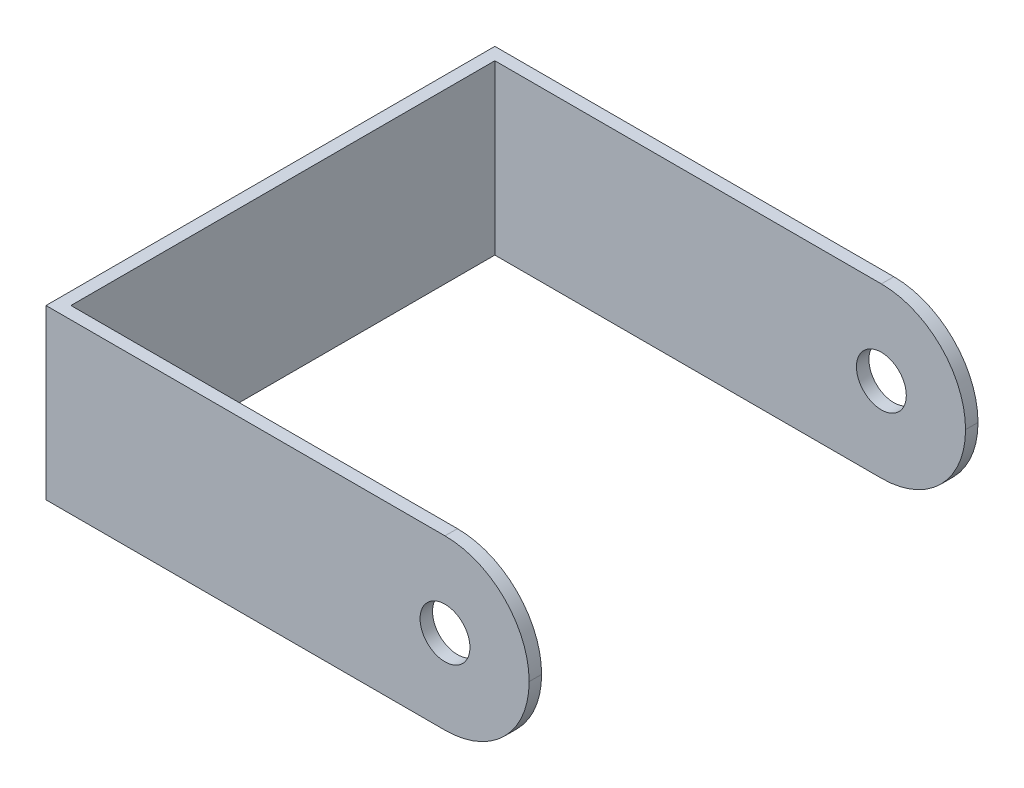
ISO-10303-21;
HEADER;
FILE_DESCRIPTION(('STEP AP214'),'2;1');
FILE_NAME('part.step','',(''),(''),'','','');
FILE_SCHEMA(('AUTOMOTIVE_DESIGN { 1 0 10303 214 1 1 1 1 }'));
ENDSEC;
DATA;
#1=APPLICATION_CONTEXT('core data for automotive mechanical design processes');
#2=APPLICATION_PROTOCOL_DEFINITION('international standard','automotive_design',2000,#1);
#3=PRODUCT_CONTEXT('',#1,'mechanical');
#4=PRODUCT('Part','Part','',(#3));
#5=PRODUCT_RELATED_PRODUCT_CATEGORY('part','',(#4));
#6=PRODUCT_DEFINITION_FORMATION('','',#4);
#7=PRODUCT_DEFINITION_CONTEXT('part definition',#1,'design');
#8=PRODUCT_DEFINITION('design','',#6,#7);
#9=PRODUCT_DEFINITION_SHAPE('','',#8);
#10=(LENGTH_UNIT() NAMED_UNIT(*) SI_UNIT(.MILLI.,.METRE.));
#11=(NAMED_UNIT(*) PLANE_ANGLE_UNIT() SI_UNIT($,.RADIAN.));
#12=(NAMED_UNIT(*) SI_UNIT($,.STERADIAN.) SOLID_ANGLE_UNIT());
#13=UNCERTAINTY_MEASURE_WITH_UNIT(LENGTH_MEASURE(1.E-05),#10,'distance_accuracy_value','');
#14=(GEOMETRIC_REPRESENTATION_CONTEXT(3) GLOBAL_UNCERTAINTY_ASSIGNED_CONTEXT((#13)) GLOBAL_UNIT_ASSIGNED_CONTEXT((#10,
#11,#12)) REPRESENTATION_CONTEXT('',''));
#15=CARTESIAN_POINT('',(0.,0.,0.));
#16=DIRECTION('',(0.,0.,1.));
#17=DIRECTION('',(1.,0.,0.));
#18=AXIS2_PLACEMENT_3D('',#15,#16,#17);
#19=CARTESIAN_POINT('',(-350.643899892701,27.,461.38590687587));
#20=DIRECTION('',(1.,0.,0.));
#21=DIRECTION('',(0.,0.,-1.));
#22=AXIS2_PLACEMENT_3D('',#19,#20,#21);
#23=PLANE('',#22);
#24=DIRECTION('',(0.,0.,1.));
#25=VECTOR('',#24,1.);
#26=CARTESIAN_POINT('',(-350.643899892701,0.,461.38590687587));
#27=LINE('',#26,#25);
#28=CARTESIAN_POINT('',(-350.643899892701,0.,389.38590687587));
#29=VERTEX_POINT('',#28);
#30=CARTESIAN_POINT('',(-350.643899892701,0.,461.38590687587));
#31=VERTEX_POINT('',#30);
#32=EDGE_CURVE('E140',#29,#31,#27,.T.);
#33=ORIENTED_EDGE('',*,*,#32,.T.);
#34=DIRECTION('',(0.,-1.,0.));
#35=VECTOR('',#34,1.);
#36=CARTESIAN_POINT('',(-350.643899892701,27.,461.38590687587));
#37=LINE('',#36,#35);
#38=CARTESIAN_POINT('',(-350.643899892701,27.,461.38590687587));
#39=VERTEX_POINT('',#38);
#40=EDGE_CURVE('E160',#39,#31,#37,.T.);
#41=ORIENTED_EDGE('',*,*,#40,.F.);
#42=DIRECTION('',(0.,0.,1.));
#43=VECTOR('',#42,1.);
#44=CARTESIAN_POINT('',(-350.643899892701,27.,461.38590687587));
#45=LINE('',#44,#43);
#46=CARTESIAN_POINT('',(-350.643899892701,27.,389.38590687587));
#47=VERTEX_POINT('',#46);
#48=EDGE_CURVE('E142',#47,#39,#45,.T.);
#49=ORIENTED_EDGE('',*,*,#48,.F.);
#50=DIRECTION('',(0.,-1.,0.));
#51=VECTOR('',#50,1.);
#52=CARTESIAN_POINT('',(-350.643899892701,27.,389.38590687587));
#53=LINE('',#52,#51);
#54=EDGE_CURVE('E151',#47,#29,#53,.T.);
#55=ORIENTED_EDGE('',*,*,#54,.T.);
#56=EDGE_LOOP('',(#33,#41,#49,#55));
#57=FACE_BOUND('',#56,.T.);
#58=ADVANCED_FACE('F33',(#57),#23,.F.);
#59=CARTESIAN_POINT('',(-273.143899892701,27.,461.38590687587));
#60=DIRECTION('',(0.,0.,-1.));
#61=DIRECTION('',(-1.,0.,0.));
#62=AXIS2_PLACEMENT_3D('',#59,#60,#61);
#63=PLANE('',#62);
#64=CARTESIAN_POINT('',(-286.643899892701,13.5,461.38590687587));
#65=DIRECTION('',(0.,0.,1.));
#66=DIRECTION('',(1.,0.,0.));
#67=AXIS2_PLACEMENT_3D('',#64,#65,#66);
#68=CIRCLE('',#67,3.99999999999999);
#69=CARTESIAN_POINT('',(-282.643899892701,13.5,461.38590687587));
#70=VERTEX_POINT('',#69);
#71=EDGE_CURVE('E353',#70,#70,#68,.T.);
#72=ORIENTED_EDGE('',*,*,#71,.F.);
#73=EDGE_LOOP('',(#72));
#74=FACE_BOUND('',#73,.T.);
#75=DIRECTION('',(1.,0.,0.));
#76=VECTOR('',#75,1.);
#77=CARTESIAN_POINT('',(-273.143899892701,0.,461.38590687587));
#78=LINE('',#77,#76);
#79=CARTESIAN_POINT('',(-286.643899892701,0.,461.38590687587));
#80=VERTEX_POINT('',#79);
#81=EDGE_CURVE('E154',#31,#80,#78,.T.);
#82=ORIENTED_EDGE('',*,*,#81,.T.);
#83=CARTESIAN_POINT('',(-286.643899892701,13.5,461.38590687587));
#84=DIRECTION('',(0.,0.,-1.));
#85=DIRECTION('',(-1.,0.,0.));
#86=AXIS2_PLACEMENT_3D('',#83,#84,#85);
#87=CIRCLE('',#86,13.5);
#88=CARTESIAN_POINT('',(-273.143899892701,13.5,461.38590687587));
#89=VERTEX_POINT('',#88);
#90=EDGE_CURVE('E172',#80,#89,#87,.F.);
#91=ORIENTED_EDGE('',*,*,#90,.T.);
#92=CARTESIAN_POINT('',(-286.643899892701,13.5,461.38590687587));
#93=DIRECTION('',(0.,0.,-1.));
#94=DIRECTION('',(-1.,0.,0.));
#95=AXIS2_PLACEMENT_3D('',#92,#93,#94);
#96=CIRCLE('',#95,13.5);
#97=CARTESIAN_POINT('',(-286.643899892701,27.,461.38590687587));
#98=VERTEX_POINT('',#97);
#99=EDGE_CURVE('E170',#89,#98,#96,.F.);
#100=ORIENTED_EDGE('',*,*,#99,.T.);
#101=DIRECTION('',(1.,0.,0.));
#102=VECTOR('',#101,1.);
#103=CARTESIAN_POINT('',(-273.143899892701,27.,461.38590687587));
#104=LINE('',#103,#102);
#105=EDGE_CURVE('E145',#39,#98,#104,.T.);
#106=ORIENTED_EDGE('',*,*,#105,.F.);
#107=ORIENTED_EDGE('',*,*,#40,.T.);
#108=EDGE_LOOP('',(#82,#91,#100,#106,#107));
#109=FACE_BOUND('',#108,.T.);
#110=ADVANCED_FACE('F206',(#74,#109),#63,.F.);
#111=CARTESIAN_POINT('',(-273.143899892701,27.,389.38590687587));
#112=DIRECTION('',(0.,0.,1.));
#113=DIRECTION('',(1.,0.,0.));
#114=AXIS2_PLACEMENT_3D('',#111,#112,#113);
#115=PLANE('',#114);
#116=CARTESIAN_POINT('',(-286.643899892701,13.5,389.38590687587));
#117=DIRECTION('',(0.,0.,1.));
#118=DIRECTION('',(1.,0.,0.));
#119=AXIS2_PLACEMENT_3D('',#116,#117,#118);
#120=CIRCLE('',#119,3.99999999999999);
#121=CARTESIAN_POINT('',(-282.643899892701,13.5,389.38590687587));
#122=VERTEX_POINT('',#121);
#123=EDGE_CURVE('E186',#122,#122,#120,.T.);
#124=ORIENTED_EDGE('',*,*,#123,.T.);
#125=EDGE_LOOP('',(#124));
#126=FACE_BOUND('',#125,.T.);
#127=CARTESIAN_POINT('',(-286.643899892701,13.5,389.38590687587));
#128=DIRECTION('',(0.,0.,1.));
#129=DIRECTION('',(1.,0.,0.));
#130=AXIS2_PLACEMENT_3D('',#127,#128,#129);
#131=CIRCLE('',#130,13.5);
#132=CARTESIAN_POINT('',(-286.643899892701,27.,389.38590687587));
#133=VERTEX_POINT('',#132);
#134=CARTESIAN_POINT('',(-273.143899892701,13.5,389.38590687587));
#135=VERTEX_POINT('',#134);
#136=EDGE_CURVE('E176',#133,#135,#131,.F.);
#137=ORIENTED_EDGE('',*,*,#136,.T.);
#138=CARTESIAN_POINT('',(-286.643899892701,13.5,389.38590687587));
#139=DIRECTION('',(0.,0.,1.));
#140=DIRECTION('',(1.,0.,0.));
#141=AXIS2_PLACEMENT_3D('',#138,#139,#140);
#142=CIRCLE('',#141,13.5);
#143=CARTESIAN_POINT('',(-286.643899892701,0.,389.38590687587));
#144=VERTEX_POINT('',#143);
#145=EDGE_CURVE('E181',#135,#144,#142,.F.);
#146=ORIENTED_EDGE('',*,*,#145,.T.);
#147=DIRECTION('',(-1.,0.,0.));
#148=VECTOR('',#147,1.);
#149=CARTESIAN_POINT('',(-273.143899892701,0.,389.38590687587));
#150=LINE('',#149,#148);
#151=EDGE_CURVE('E146',#144,#29,#150,.T.);
#152=ORIENTED_EDGE('',*,*,#151,.T.);
#153=ORIENTED_EDGE('',*,*,#54,.F.);
#154=DIRECTION('',(-1.,0.,0.));
#155=VECTOR('',#154,1.);
#156=CARTESIAN_POINT('',(-273.143899892701,27.,389.38590687587));
#157=LINE('',#156,#155);
#158=EDGE_CURVE('E149',#133,#47,#157,.T.);
#159=ORIENTED_EDGE('',*,*,#158,.F.);
#160=EDGE_LOOP('',(#137,#146,#152,#153,#159));
#161=FACE_BOUND('',#160,.T.);
#162=ADVANCED_FACE('F220',(#126,#161),#115,.F.);
#163=CARTESIAN_POINT('',(0.,27.,0.));
#164=DIRECTION('',(0.,1.,0.));
#165=DIRECTION('',(0.,0.,1.));
#166=AXIS2_PLACEMENT_3D('',#163,#164,#165);
#167=PLANE('',#166);
#168=DIRECTION('',(-1.,0.,0.));
#169=VECTOR('',#168,1.);
#170=CARTESIAN_POINT('',(-275.143899892701,27.,391.38590687587));
#171=LINE('',#170,#169);
#172=CARTESIAN_POINT('',(-286.643899892701,27.,391.38590687587));
#173=VERTEX_POINT('',#172);
#174=CARTESIAN_POINT('',(-348.643899892701,27.,391.38590687587));
#175=VERTEX_POINT('',#174);
#176=EDGE_CURVE('E122',#173,#175,#171,.T.);
#177=ORIENTED_EDGE('',*,*,#176,.F.);
#178=DIRECTION('',(0.,0.,-1.));
#179=VECTOR('',#178,1.);
#180=CARTESIAN_POINT('',(-286.643899892701,27.,389.38590687587));
#181=LINE('',#180,#179);
#182=EDGE_CURVE('E11',#173,#133,#181,.T.);
#183=ORIENTED_EDGE('',*,*,#182,.T.);
#184=ORIENTED_EDGE('',*,*,#158,.T.);
#185=ORIENTED_EDGE('',*,*,#48,.T.);
#186=ORIENTED_EDGE('',*,*,#105,.T.);
#187=DIRECTION('',(0.,0.,-1.));
#188=VECTOR('',#187,1.);
#189=CARTESIAN_POINT('',(-286.643899892701,27.,459.38590687587));
#190=LINE('',#189,#188);
#191=CARTESIAN_POINT('',(-286.643899892701,27.,459.38590687587));
#192=VERTEX_POINT('',#191);
#193=EDGE_CURVE('E174',#98,#192,#190,.T.);
#194=ORIENTED_EDGE('',*,*,#193,.T.);
#195=DIRECTION('',(1.,0.,0.));
#196=VECTOR('',#195,1.);
#197=CARTESIAN_POINT('',(-348.643899892701,27.,459.38590687587));
#198=LINE('',#197,#196);
#199=CARTESIAN_POINT('',(-348.643899892701,27.,459.38590687587));
#200=VERTEX_POINT('',#199);
#201=EDGE_CURVE('E133',#200,#192,#198,.T.);
#202=ORIENTED_EDGE('',*,*,#201,.F.);
#203=DIRECTION('',(0.,0.,1.));
#204=VECTOR('',#203,1.);
#205=CARTESIAN_POINT('',(-348.643899892701,27.,391.38590687587));
#206=LINE('',#205,#204);
#207=EDGE_CURVE('E138',#175,#200,#206,.T.);
#208=ORIENTED_EDGE('',*,*,#207,.F.);
#209=EDGE_LOOP('',(#177,#183,#184,#185,#186,#194,#202,#208));
#210=FACE_BOUND('',#209,.T.);
#211=ADVANCED_FACE('F213',(#210),#167,.T.);
#212=CARTESIAN_POINT('',(0.,0.,0.));
#213=DIRECTION('',(0.,1.,0.));
#214=DIRECTION('',(0.,0.,1.));
#215=AXIS2_PLACEMENT_3D('',#212,#213,#214);
#216=PLANE('',#215);
#217=ORIENTED_EDGE('',*,*,#151,.F.);
#218=DIRECTION('',(0.,0.,-1.));
#219=VECTOR('',#218,1.);
#220=CARTESIAN_POINT('',(-286.643899892701,0.,0.));
#221=LINE('',#220,#219);
#222=CARTESIAN_POINT('',(-286.643899892701,0.,391.38590687587));
#223=VERTEX_POINT('',#222);
#224=EDGE_CURVE('E116',#144,#223,#221,.F.);
#225=ORIENTED_EDGE('',*,*,#224,.T.);
#226=DIRECTION('',(-1.,0.,0.));
#227=VECTOR('',#226,1.);
#228=CARTESIAN_POINT('',(-275.143899892701,0.,391.38590687587));
#229=LINE('',#228,#227);
#230=CARTESIAN_POINT('',(-348.643899892701,0.,391.38590687587));
#231=VERTEX_POINT('',#230);
#232=EDGE_CURVE('E108',#223,#231,#229,.T.);
#233=ORIENTED_EDGE('',*,*,#232,.T.);
#234=DIRECTION('',(0.,0.,1.));
#235=VECTOR('',#234,1.);
#236=CARTESIAN_POINT('',(-348.643899892701,0.,391.38590687587));
#237=LINE('',#236,#235);
#238=CARTESIAN_POINT('',(-348.643899892701,0.,459.38590687587));
#239=VERTEX_POINT('',#238);
#240=EDGE_CURVE('E114',#231,#239,#237,.T.);
#241=ORIENTED_EDGE('',*,*,#240,.T.);
#242=DIRECTION('',(1.,0.,0.));
#243=VECTOR('',#242,1.);
#244=CARTESIAN_POINT('',(-348.643899892701,0.,459.38590687587));
#245=LINE('',#244,#243);
#246=CARTESIAN_POINT('',(-286.643899892701,0.,459.38590687587));
#247=VERTEX_POINT('',#246);
#248=EDGE_CURVE('E117',#239,#247,#245,.T.);
#249=ORIENTED_EDGE('',*,*,#248,.T.);
#250=DIRECTION('',(0.,0.,-1.));
#251=VECTOR('',#250,1.);
#252=CARTESIAN_POINT('',(-286.643899892701,0.,0.));
#253=LINE('',#252,#251);
#254=EDGE_CURVE('E167',#247,#80,#253,.F.);
#255=ORIENTED_EDGE('',*,*,#254,.T.);
#256=ORIENTED_EDGE('',*,*,#81,.F.);
#257=ORIENTED_EDGE('',*,*,#32,.F.);
#258=EDGE_LOOP('',(#217,#225,#233,#241,#249,#255,#256,#257));
#259=FACE_BOUND('',#258,.T.);
#260=ADVANCED_FACE('F111',(#259),#216,.F.);
#261=CARTESIAN_POINT('',(-348.643899892701,0.,459.38590687587));
#262=DIRECTION('',(0.,0.,1.));
#263=DIRECTION('',(1.,0.,0.));
#264=AXIS2_PLACEMENT_3D('',#261,#262,#263);
#265=PLANE('',#264);
#266=CARTESIAN_POINT('',(-286.643899892701,13.5,459.38590687587));
#267=DIRECTION('',(0.,0.,1.));
#268=DIRECTION('',(1.,0.,0.));
#269=AXIS2_PLACEMENT_3D('',#266,#267,#268);
#270=CIRCLE('',#269,3.99999999999999);
#271=CARTESIAN_POINT('',(-282.643899892701,13.5,459.38590687587));
#272=VERTEX_POINT('',#271);
#273=EDGE_CURVE('E191',#272,#272,#270,.T.);
#274=ORIENTED_EDGE('',*,*,#273,.T.);
#275=EDGE_LOOP('',(#274));
#276=FACE_BOUND('',#275,.T.);
#277=CARTESIAN_POINT('',(-286.643899892701,13.5,459.38590687587));
#278=DIRECTION('',(0.,0.,1.));
#279=DIRECTION('',(1.,0.,0.));
#280=AXIS2_PLACEMENT_3D('',#277,#278,#279);
#281=CIRCLE('',#280,13.5);
#282=CARTESIAN_POINT('',(-273.143899892701,13.5,459.38590687587));
#283=VERTEX_POINT('',#282);
#284=EDGE_CURVE('E163',#192,#283,#281,.F.);
#285=ORIENTED_EDGE('',*,*,#284,.T.);
#286=CARTESIAN_POINT('',(-286.643899892701,13.5,459.38590687587));
#287=DIRECTION('',(0.,0.,1.));
#288=DIRECTION('',(1.,0.,0.));
#289=AXIS2_PLACEMENT_3D('',#286,#287,#288);
#290=CIRCLE('',#289,13.5);
#291=EDGE_CURVE('E165',#283,#247,#290,.F.);
#292=ORIENTED_EDGE('',*,*,#291,.T.);
#293=ORIENTED_EDGE('',*,*,#248,.F.);
#294=DIRECTION('',(0.,1.,0.));
#295=VECTOR('',#294,1.);
#296=CARTESIAN_POINT('',(-348.643899892701,0.,459.38590687587));
#297=LINE('',#296,#295);
#298=EDGE_CURVE('E126',#239,#200,#297,.T.);
#299=ORIENTED_EDGE('',*,*,#298,.T.);
#300=ORIENTED_EDGE('',*,*,#201,.T.);
#301=EDGE_LOOP('',(#285,#292,#293,#299,#300));
#302=FACE_BOUND('',#301,.T.);
#303=ADVANCED_FACE('F214',(#276,#302),#265,.F.);
#304=CARTESIAN_POINT('',(-348.643899892701,0.,391.38590687587));
#305=DIRECTION('',(-1.,0.,0.));
#306=DIRECTION('',(0.,0.,1.));
#307=AXIS2_PLACEMENT_3D('',#304,#305,#306);
#308=PLANE('',#307);
#309=ORIENTED_EDGE('',*,*,#207,.T.);
#310=ORIENTED_EDGE('',*,*,#298,.F.);
#311=ORIENTED_EDGE('',*,*,#240,.F.);
#312=DIRECTION('',(0.,1.,0.));
#313=VECTOR('',#312,1.);
#314=CARTESIAN_POINT('',(-348.643899892701,0.,391.38590687587));
#315=LINE('',#314,#313);
#316=EDGE_CURVE('E120',#231,#175,#315,.T.);
#317=ORIENTED_EDGE('',*,*,#316,.T.);
#318=EDGE_LOOP('',(#309,#310,#311,#317));
#319=FACE_BOUND('',#318,.T.);
#320=ADVANCED_FACE('F128',(#319),#308,.F.);
#321=CARTESIAN_POINT('',(-275.143899892701,0.,391.38590687587));
#322=DIRECTION('',(0.,0.,-1.));
#323=DIRECTION('',(-1.,0.,0.));
#324=AXIS2_PLACEMENT_3D('',#321,#322,#323);
#325=PLANE('',#324);
#326=CARTESIAN_POINT('',(-286.643899892701,13.5,391.38590687587));
#327=DIRECTION('',(0.,0.,-1.));
#328=DIRECTION('',(-1.,0.,0.));
#329=AXIS2_PLACEMENT_3D('',#326,#327,#328);
#330=CIRCLE('',#329,3.99999999999999);
#331=CARTESIAN_POINT('',(-290.643899892701,13.5,391.38590687587));
#332=VERTEX_POINT('',#331);
#333=EDGE_CURVE('E37',#332,#332,#330,.T.);
#334=ORIENTED_EDGE('',*,*,#333,.T.);
#335=EDGE_LOOP('',(#334));
#336=FACE_BOUND('',#335,.T.);
#337=ORIENTED_EDGE('',*,*,#232,.F.);
#338=CARTESIAN_POINT('',(-286.643899892701,13.5,391.38590687587));
#339=DIRECTION('',(0.,0.,-1.));
#340=DIRECTION('',(-1.,0.,0.));
#341=AXIS2_PLACEMENT_3D('',#338,#339,#340);
#342=CIRCLE('',#341,13.5);
#343=CARTESIAN_POINT('',(-273.143899892701,13.5,391.38590687587));
#344=VERTEX_POINT('',#343);
#345=EDGE_CURVE('E42',#223,#344,#342,.F.);
#346=ORIENTED_EDGE('',*,*,#345,.T.);
#347=CARTESIAN_POINT('',(-286.643899892701,13.5,391.38590687587));
#348=DIRECTION('',(0.,0.,-1.));
#349=DIRECTION('',(-1.,0.,0.));
#350=AXIS2_PLACEMENT_3D('',#347,#348,#349);
#351=CIRCLE('',#350,13.5);
#352=EDGE_CURVE('E53',#344,#173,#351,.F.);
#353=ORIENTED_EDGE('',*,*,#352,.T.);
#354=ORIENTED_EDGE('',*,*,#176,.T.);
#355=ORIENTED_EDGE('',*,*,#316,.F.);
#356=EDGE_LOOP('',(#337,#346,#353,#354,#355));
#357=FACE_BOUND('',#356,.T.);
#358=ADVANCED_FACE('F121',(#336,#357),#325,.F.);
#359=CARTESIAN_POINT('',(-286.643899892701,13.5,0.));
#360=DIRECTION('',(0.,0.,1.));
#361=DIRECTION('',(1.,0.,0.));
#362=AXIS2_PLACEMENT_3D('',#359,#360,#361);
#363=CYLINDRICAL_SURFACE('',#362,13.5);
#364=ORIENTED_EDGE('',*,*,#193,.F.);
#365=ORIENTED_EDGE('',*,*,#99,.F.);
#366=DIRECTION('',(0.,0.,-1.));
#367=VECTOR('',#366,1.);
#368=CARTESIAN_POINT('',(-273.143899892701,13.5,461.38590687587));
#369=LINE('',#368,#367);
#370=EDGE_CURVE('E136',#283,#89,#369,.F.);
#371=ORIENTED_EDGE('',*,*,#370,.F.);
#372=ORIENTED_EDGE('',*,*,#284,.F.);
#373=EDGE_LOOP('',(#364,#365,#371,#372));
#374=FACE_BOUND('',#373,.T.);
#375=ADVANCED_FACE('F209',(#374),#363,.T.);
#376=CARTESIAN_POINT('',(-286.643899892701,13.5,461.38590687587));
#377=DIRECTION('',(0.,0.,-1.));
#378=DIRECTION('',(-1.,0.,0.));
#379=AXIS2_PLACEMENT_3D('',#376,#377,#378);
#380=CYLINDRICAL_SURFACE('',#379,13.5);
#381=ORIENTED_EDGE('',*,*,#90,.F.);
#382=ORIENTED_EDGE('',*,*,#254,.F.);
#383=ORIENTED_EDGE('',*,*,#291,.F.);
#384=ORIENTED_EDGE('',*,*,#370,.T.);
#385=EDGE_LOOP('',(#381,#382,#383,#384));
#386=FACE_BOUND('',#385,.T.);
#387=ADVANCED_FACE('F202',(#386),#380,.T.);
#388=CARTESIAN_POINT('',(-286.643899892701,13.5,0.));
#389=DIRECTION('',(0.,0.,1.));
#390=DIRECTION('',(1.,0.,0.));
#391=AXIS2_PLACEMENT_3D('',#388,#389,#390);
#392=CYLINDRICAL_SURFACE('',#391,13.5);
#393=ORIENTED_EDGE('',*,*,#182,.F.);
#394=ORIENTED_EDGE('',*,*,#352,.F.);
#395=DIRECTION('',(0.,0.,-1.));
#396=VECTOR('',#395,1.);
#397=CARTESIAN_POINT('',(-273.143899892701,13.5,391.38590687587));
#398=LINE('',#397,#396);
#399=EDGE_CURVE('E179',#135,#344,#398,.F.);
#400=ORIENTED_EDGE('',*,*,#399,.F.);
#401=ORIENTED_EDGE('',*,*,#136,.F.);
#402=EDGE_LOOP('',(#393,#394,#400,#401));
#403=FACE_BOUND('',#402,.T.);
#404=ADVANCED_FACE('F35',(#403),#392,.T.);
#405=CARTESIAN_POINT('',(-286.643899892701,13.5,461.38590687587));
#406=DIRECTION('',(0.,0.,-1.));
#407=DIRECTION('',(-1.,0.,0.));
#408=AXIS2_PLACEMENT_3D('',#405,#406,#407);
#409=CYLINDRICAL_SURFACE('',#408,13.5);
#410=ORIENTED_EDGE('',*,*,#345,.F.);
#411=ORIENTED_EDGE('',*,*,#224,.F.);
#412=ORIENTED_EDGE('',*,*,#145,.F.);
#413=ORIENTED_EDGE('',*,*,#399,.T.);
#414=EDGE_LOOP('',(#410,#411,#412,#413));
#415=FACE_BOUND('',#414,.T.);
#416=ADVANCED_FACE('F226',(#415),#409,.T.);
#417=CARTESIAN_POINT('',(-286.643899892701,13.5,367.38590687587));
#418=DIRECTION('',(0.,0.,1.));
#419=DIRECTION('',(1.,0.,0.));
#420=AXIS2_PLACEMENT_3D('',#417,#418,#419);
#421=CYLINDRICAL_SURFACE('',#420,3.99999999999999);
#422=ORIENTED_EDGE('',*,*,#333,.F.);
#423=EDGE_LOOP('',(#422));
#424=FACE_BOUND('',#423,.T.);
#425=ORIENTED_EDGE('',*,*,#123,.F.);
#426=EDGE_LOOP('',(#425));
#427=FACE_BOUND('',#426,.T.);
#428=ADVANCED_FACE('F228',(#424,#427),#421,.F.);
#429=ORIENTED_EDGE('',*,*,#71,.T.);
#430=EDGE_LOOP('',(#429));
#431=FACE_BOUND('',#430,.T.);
#432=ORIENTED_EDGE('',*,*,#273,.F.);
#433=EDGE_LOOP('',(#432));
#434=FACE_BOUND('',#433,.T.);
#435=ADVANCED_FACE('F233',(#431,#434),#421,.F.);
#436=CLOSED_SHELL('',(#58,#110,#162,#211,#260,#303,#320,#358,#375,#387,#404,#416,#428,#435));
#437=MANIFOLD_SOLID_BREP('B2',#436);
#438=ADVANCED_BREP_SHAPE_REPRESENTATION('',(#18,#437),#14);
#439=SHAPE_DEFINITION_REPRESENTATION(#9,#438);
ENDSEC;
END-ISO-10303-21;
